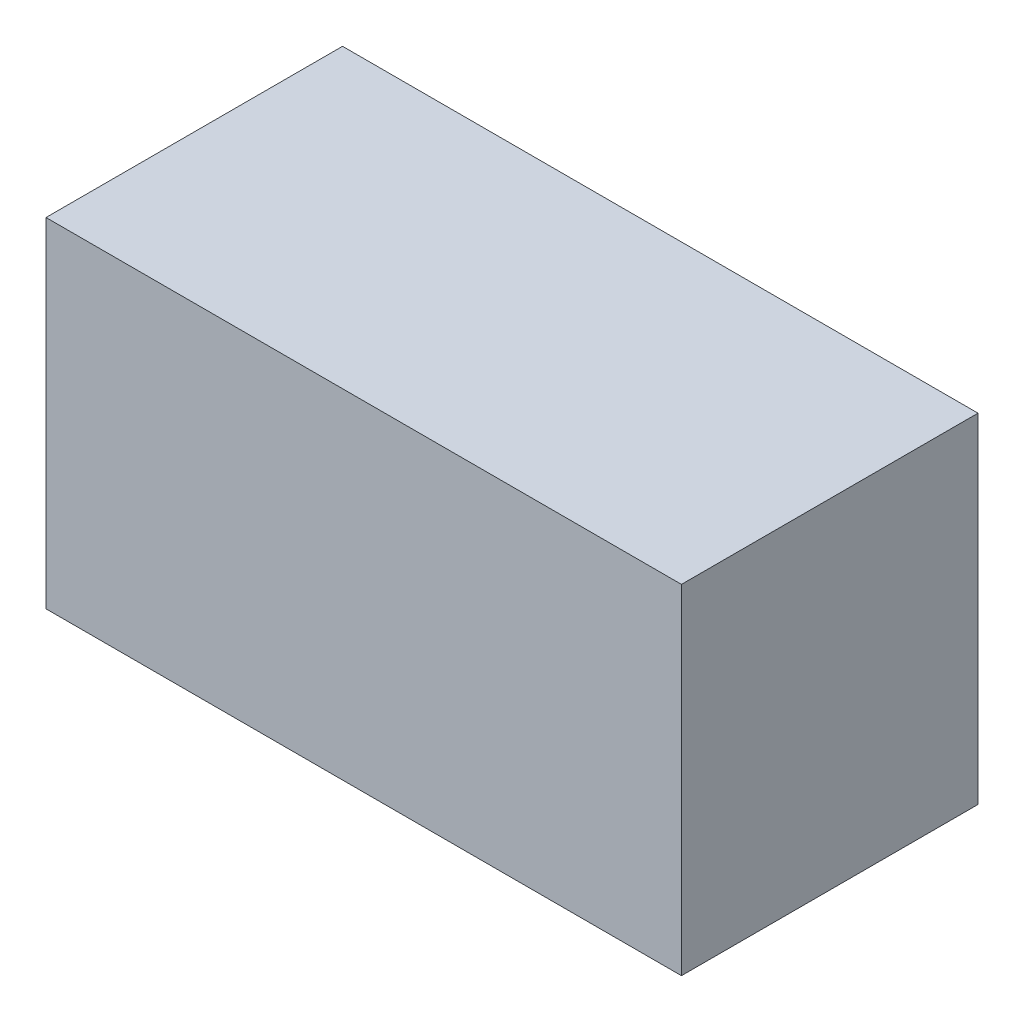
ISO-10303-21;
HEADER;
FILE_DESCRIPTION(('STEP AP214'),'2;1');
FILE_NAME('part.step','',(''),(''),'','','');
FILE_SCHEMA(('AUTOMOTIVE_DESIGN { 1 0 10303 214 1 1 1 1 }'));
ENDSEC;
DATA;
#1=APPLICATION_CONTEXT('core data for automotive mechanical design processes');
#2=APPLICATION_PROTOCOL_DEFINITION('international standard','automotive_design',2000,#1);
#3=PRODUCT_CONTEXT('',#1,'mechanical');
#4=PRODUCT('Part','Part','',(#3));
#5=PRODUCT_RELATED_PRODUCT_CATEGORY('part','',(#4));
#6=PRODUCT_DEFINITION_FORMATION('','',#4);
#7=PRODUCT_DEFINITION_CONTEXT('part definition',#1,'design');
#8=PRODUCT_DEFINITION('design','',#6,#7);
#9=PRODUCT_DEFINITION_SHAPE('','',#8);
#10=(LENGTH_UNIT() NAMED_UNIT(*) SI_UNIT(.MILLI.,.METRE.));
#11=(NAMED_UNIT(*) PLANE_ANGLE_UNIT() SI_UNIT($,.RADIAN.));
#12=(NAMED_UNIT(*) SI_UNIT($,.STERADIAN.) SOLID_ANGLE_UNIT());
#13=UNCERTAINTY_MEASURE_WITH_UNIT(LENGTH_MEASURE(1.E-05),#10,'distance_accuracy_value','');
#14=(GEOMETRIC_REPRESENTATION_CONTEXT(3) GLOBAL_UNCERTAINTY_ASSIGNED_CONTEXT((#13)) GLOBAL_UNIT_ASSIGNED_CONTEXT((#10,
#11,#12)) REPRESENTATION_CONTEXT('',''));
#15=CARTESIAN_POINT('',(0.,0.,0.));
#16=DIRECTION('',(0.,0.,1.));
#17=DIRECTION('',(1.,0.,0.));
#18=AXIS2_PLACEMENT_3D('',#15,#16,#17);
#19=CARTESIAN_POINT('',(130.904412210555,-77.5585556642335,21.));
#20=DIRECTION('',(0.,1.,0.));
#21=DIRECTION('',(0.,0.,1.));
#22=AXIS2_PLACEMENT_3D('',#19,#20,#21);
#23=PLANE('',#22);
#24=DIRECTION('',(1.,0.,0.));
#25=VECTOR('',#24,1.);
#26=CARTESIAN_POINT('',(130.904412210555,-77.5585556642335,0.));
#27=LINE('',#26,#25);
#28=CARTESIAN_POINT('',(130.904412210555,-77.5585556642335,0.));
#29=VERTEX_POINT('',#28);
#30=CARTESIAN_POINT('',(175.904412210555,-77.5585556642335,0.));
#31=VERTEX_POINT('',#30);
#32=EDGE_CURVE('E101',#29,#31,#27,.T.);
#33=ORIENTED_EDGE('',*,*,#32,.T.);
#34=DIRECTION('',(0.,0.,-1.));
#35=VECTOR('',#34,1.);
#36=CARTESIAN_POINT('',(175.904412210555,-77.5585556642335,21.));
#37=LINE('',#36,#35);
#38=CARTESIAN_POINT('',(175.904412210555,-77.5585556642335,21.));
#39=VERTEX_POINT('',#38);
#40=EDGE_CURVE('E11',#39,#31,#37,.T.);
#41=ORIENTED_EDGE('',*,*,#40,.F.);
#42=DIRECTION('',(1.,0.,0.));
#43=VECTOR('',#42,1.);
#44=CARTESIAN_POINT('',(130.904412210555,-77.5585556642335,21.));
#45=LINE('',#44,#43);
#46=CARTESIAN_POINT('',(130.904412210555,-77.5585556642335,21.));
#47=VERTEX_POINT('',#46);
#48=EDGE_CURVE('E78',#47,#39,#45,.T.);
#49=ORIENTED_EDGE('',*,*,#48,.F.);
#50=DIRECTION('',(0.,0.,-1.));
#51=VECTOR('',#50,1.);
#52=CARTESIAN_POINT('',(130.904412210555,-77.5585556642335,21.));
#53=LINE('',#52,#51);
#54=EDGE_CURVE('E97',#47,#29,#53,.T.);
#55=ORIENTED_EDGE('',*,*,#54,.T.);
#56=EDGE_LOOP('',(#33,#41,#49,#55));
#57=FACE_BOUND('',#56,.T.);
#58=ADVANCED_FACE('F39',(#57),#23,.F.);
#59=CARTESIAN_POINT('',(175.904412210555,-53.5585556642335,21.));
#60=DIRECTION('',(1.,0.,0.));
#61=DIRECTION('',(0.,1.,0.));
#62=AXIS2_PLACEMENT_3D('',#59,#60,#61);
#63=PLANE('',#62);
#64=DIRECTION('',(0.,-1.,0.));
#65=VECTOR('',#64,1.);
#66=CARTESIAN_POINT('',(175.904412210555,-53.5585556642335,0.));
#67=LINE('',#66,#65);
#68=CARTESIAN_POINT('',(175.904412210555,-53.5585556642335,0.));
#69=VERTEX_POINT('',#68);
#70=EDGE_CURVE('E87',#69,#31,#67,.T.);
#71=ORIENTED_EDGE('',*,*,#70,.F.);
#72=DIRECTION('',(0.,0.,-1.));
#73=VECTOR('',#72,1.);
#74=CARTESIAN_POINT('',(175.904412210555,-53.5585556642335,21.));
#75=LINE('',#74,#73);
#76=CARTESIAN_POINT('',(175.904412210555,-53.5585556642335,21.));
#77=VERTEX_POINT('',#76);
#78=EDGE_CURVE('E47',#77,#69,#75,.T.);
#79=ORIENTED_EDGE('',*,*,#78,.F.);
#80=DIRECTION('',(0.,-1.,0.));
#81=VECTOR('',#80,1.);
#82=CARTESIAN_POINT('',(175.904412210555,-53.5585556642335,21.));
#83=LINE('',#82,#81);
#84=EDGE_CURVE('E85',#77,#39,#83,.T.);
#85=ORIENTED_EDGE('',*,*,#84,.T.);
#86=ORIENTED_EDGE('',*,*,#40,.T.);
#87=EDGE_LOOP('',(#71,#79,#85,#86));
#88=FACE_BOUND('',#87,.T.);
#89=ADVANCED_FACE('F84',(#88),#63,.T.);
#90=CARTESIAN_POINT('',(130.904412210555,-53.5585556642335,21.));
#91=DIRECTION('',(0.,1.,0.));
#92=DIRECTION('',(0.,0.,1.));
#93=AXIS2_PLACEMENT_3D('',#90,#91,#92);
#94=PLANE('',#93);
#95=DIRECTION('',(1.,0.,0.));
#96=VECTOR('',#95,1.);
#97=CARTESIAN_POINT('',(130.904412210555,-53.5585556642335,0.));
#98=LINE('',#97,#96);
#99=CARTESIAN_POINT('',(130.904412210555,-53.5585556642335,0.));
#100=VERTEX_POINT('',#99);
#101=EDGE_CURVE('E105',#100,#69,#98,.T.);
#102=ORIENTED_EDGE('',*,*,#101,.F.);
#103=DIRECTION('',(0.,0.,-1.));
#104=VECTOR('',#103,1.);
#105=CARTESIAN_POINT('',(130.904412210555,-53.5585556642335,21.));
#106=LINE('',#105,#104);
#107=CARTESIAN_POINT('',(130.904412210555,-53.5585556642335,21.));
#108=VERTEX_POINT('',#107);
#109=EDGE_CURVE('E70',#108,#100,#106,.T.);
#110=ORIENTED_EDGE('',*,*,#109,.F.);
#111=DIRECTION('',(1.,0.,0.));
#112=VECTOR('',#111,1.);
#113=CARTESIAN_POINT('',(130.904412210555,-53.5585556642335,21.));
#114=LINE('',#113,#112);
#115=EDGE_CURVE('E93',#108,#77,#114,.T.);
#116=ORIENTED_EDGE('',*,*,#115,.T.);
#117=ORIENTED_EDGE('',*,*,#78,.T.);
#118=EDGE_LOOP('',(#102,#110,#116,#117));
#119=FACE_BOUND('',#118,.T.);
#120=ADVANCED_FACE('F95',(#119),#94,.T.);
#121=CARTESIAN_POINT('',(130.904412210555,-53.5585556642335,21.));
#122=DIRECTION('',(1.,0.,0.));
#123=DIRECTION('',(0.,0.,-1.));
#124=AXIS2_PLACEMENT_3D('',#121,#122,#123);
#125=PLANE('',#124);
#126=DIRECTION('',(0.,-1.,0.));
#127=VECTOR('',#126,1.);
#128=CARTESIAN_POINT('',(130.904412210555,-53.5585556642335,0.));
#129=LINE('',#128,#127);
#130=EDGE_CURVE('E73',#100,#29,#129,.T.);
#131=ORIENTED_EDGE('',*,*,#130,.T.);
#132=ORIENTED_EDGE('',*,*,#54,.F.);
#133=DIRECTION('',(0.,-1.,0.));
#134=VECTOR('',#133,1.);
#135=CARTESIAN_POINT('',(130.904412210555,-53.5585556642335,21.));
#136=LINE('',#135,#134);
#137=EDGE_CURVE('E55',#108,#47,#136,.T.);
#138=ORIENTED_EDGE('',*,*,#137,.F.);
#139=ORIENTED_EDGE('',*,*,#109,.T.);
#140=EDGE_LOOP('',(#131,#132,#138,#139));
#141=FACE_BOUND('',#140,.T.);
#142=ADVANCED_FACE('F118',(#141),#125,.F.);
#143=CARTESIAN_POINT('',(0.,0.,21.));
#144=DIRECTION('',(0.,0.,-1.));
#145=DIRECTION('',(-1.,0.,0.));
#146=AXIS2_PLACEMENT_3D('',#143,#144,#145);
#147=PLANE('',#146);
#148=ORIENTED_EDGE('',*,*,#48,.T.);
#149=ORIENTED_EDGE('',*,*,#84,.F.);
#150=ORIENTED_EDGE('',*,*,#115,.F.);
#151=ORIENTED_EDGE('',*,*,#137,.T.);
#152=EDGE_LOOP('',(#148,#149,#150,#151));
#153=FACE_BOUND('',#152,.T.);
#154=ADVANCED_FACE('F92',(#153),#147,.F.);
#155=CARTESIAN_POINT('',(0.,0.,0.));
#156=DIRECTION('',(0.,0.,-1.));
#157=DIRECTION('',(-1.,0.,0.));
#158=AXIS2_PLACEMENT_3D('',#155,#156,#157);
#159=PLANE('',#158);
#160=ORIENTED_EDGE('',*,*,#32,.F.);
#161=ORIENTED_EDGE('',*,*,#130,.F.);
#162=ORIENTED_EDGE('',*,*,#101,.T.);
#163=ORIENTED_EDGE('',*,*,#70,.T.);
#164=EDGE_LOOP('',(#160,#161,#162,#163));
#165=FACE_BOUND('',#164,.T.);
#166=ADVANCED_FACE('F112',(#165),#159,.T.);
#167=CLOSED_SHELL('',(#58,#89,#120,#142,#154,#166));
#168=MANIFOLD_SOLID_BREP('B2',#167);
#169=ADVANCED_BREP_SHAPE_REPRESENTATION('',(#18,#168),#14);
#170=SHAPE_DEFINITION_REPRESENTATION(#9,#169);
ENDSEC;
END-ISO-10303-21;
